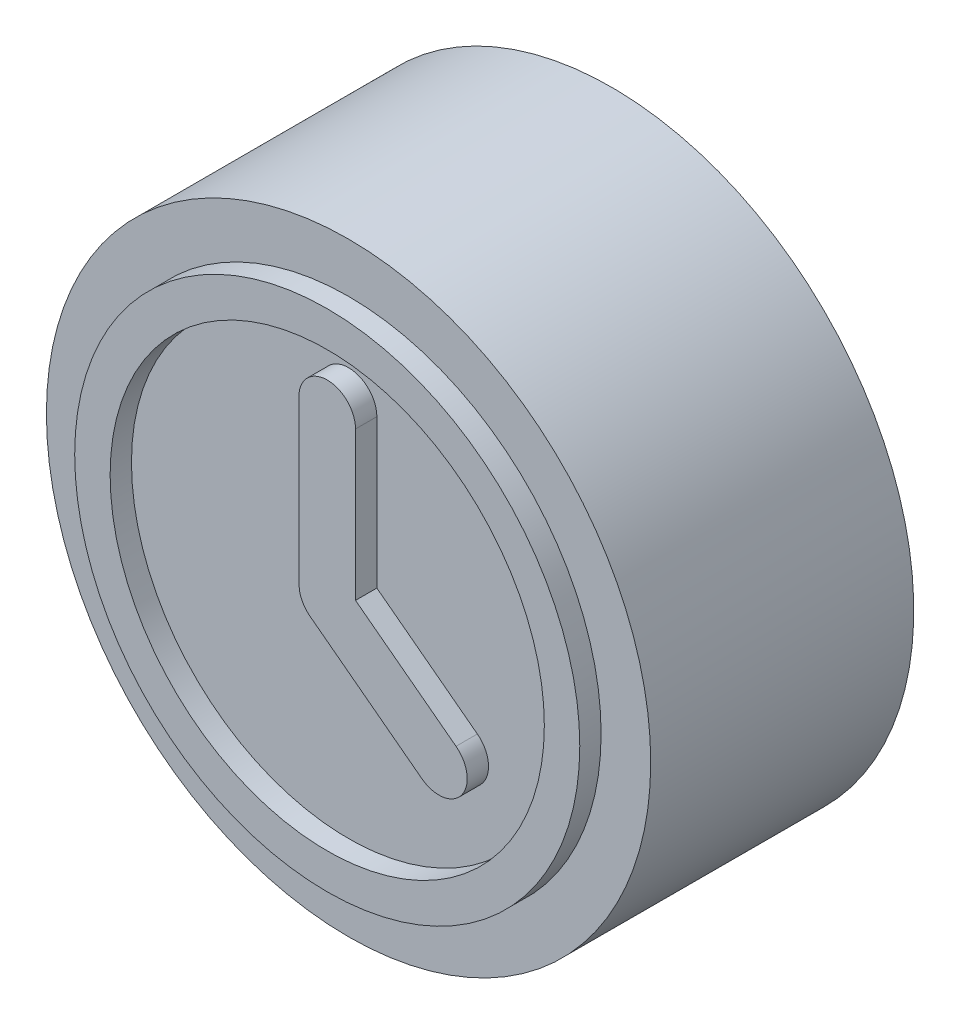
ISO-10303-21;
HEADER;
FILE_DESCRIPTION(('STEP AP214'),'2;1');
FILE_NAME('part.step','',(''),(''),'','','');
FILE_SCHEMA(('AUTOMOTIVE_DESIGN { 1 0 10303 214 1 1 1 1 }'));
ENDSEC;
DATA;
#1=APPLICATION_CONTEXT('core data for automotive mechanical design processes');
#2=APPLICATION_PROTOCOL_DEFINITION('international standard','automotive_design',2000,#1);
#3=PRODUCT_CONTEXT('',#1,'mechanical');
#4=PRODUCT('Part','Part','',(#3));
#5=PRODUCT_RELATED_PRODUCT_CATEGORY('part','',(#4));
#6=PRODUCT_DEFINITION_FORMATION('','',#4);
#7=PRODUCT_DEFINITION_CONTEXT('part definition',#1,'design');
#8=PRODUCT_DEFINITION('design','',#6,#7);
#9=PRODUCT_DEFINITION_SHAPE('','',#8);
#10=(LENGTH_UNIT() NAMED_UNIT(*) SI_UNIT(.MILLI.,.METRE.));
#11=(NAMED_UNIT(*) PLANE_ANGLE_UNIT() SI_UNIT($,.RADIAN.));
#12=(NAMED_UNIT(*) SI_UNIT($,.STERADIAN.) SOLID_ANGLE_UNIT());
#13=UNCERTAINTY_MEASURE_WITH_UNIT(LENGTH_MEASURE(1.E-05),#10,'distance_accuracy_value','');
#14=(GEOMETRIC_REPRESENTATION_CONTEXT(3) GLOBAL_UNCERTAINTY_ASSIGNED_CONTEXT((#13)) GLOBAL_UNIT_ASSIGNED_CONTEXT((#10,
#11,#12)) REPRESENTATION_CONTEXT('',''));
#15=CARTESIAN_POINT('',(0.,0.,0.));
#16=DIRECTION('',(0.,0.,1.));
#17=DIRECTION('',(1.,0.,0.));
#18=AXIS2_PLACEMENT_3D('',#15,#16,#17);
#19=CARTESIAN_POINT('',(0.,0.,4.4));
#20=DIRECTION('',(0.,0.,1.));
#21=DIRECTION('',(1.,0.,0.));
#22=AXIS2_PLACEMENT_3D('',#19,#20,#21);
#23=PLANE('',#22);
#24=CARTESIAN_POINT('',(0.,0.,4.4));
#25=DIRECTION('',(0.,0.,1.));
#26=DIRECTION('',(1.,0.,0.));
#27=AXIS2_PLACEMENT_3D('',#24,#25,#26);
#28=CIRCLE('',#27,6.10729840471998);
#29=CARTESIAN_POINT('',(6.10729840471998,0.,4.4));
#30=VERTEX_POINT('',#29);
#31=EDGE_CURVE('E12',#30,#30,#28,.F.);
#32=ORIENTED_EDGE('',*,*,#31,.F.);
#33=EDGE_LOOP('',(#32));
#34=FACE_BOUND('',#33,.T.);
#35=DIRECTION('',(0.,1.,0.));
#36=VECTOR('',#35,1.);
#37=CARTESIAN_POINT('',(-0.795758580455441,0.,4.4));
#38=LINE('',#37,#36);
#39=CARTESIAN_POINT('',(-0.795758580455441,0.,4.4));
#40=VERTEX_POINT('',#39);
#41=CARTESIAN_POINT('',(-0.795758580455441,4.57097817354679,4.4));
#42=VERTEX_POINT('',#41);
#43=EDGE_CURVE('E155',#40,#42,#38,.T.);
#44=ORIENTED_EDGE('',*,*,#43,.T.);
#45=CARTESIAN_POINT('',(0.,4.57097817354679,4.4));
#46=DIRECTION('',(0.,0.,1.));
#47=DIRECTION('',(1.,0.,0.));
#48=AXIS2_PLACEMENT_3D('',#45,#46,#47);
#49=CIRCLE('',#48,0.795758580455441);
#50=CARTESIAN_POINT('',(0.795758580455441,4.57097817354679,4.4));
#51=VERTEX_POINT('',#50);
#52=EDGE_CURVE('E174',#51,#42,#49,.T.);
#53=ORIENTED_EDGE('',*,*,#52,.F.);
#54=DIRECTION('',(0.,1.,0.));
#55=VECTOR('',#54,1.);
#56=CARTESIAN_POINT('',(0.795758580455441,0.,4.4));
#57=LINE('',#56,#55);
#58=CARTESIAN_POINT('',(0.795758580455441,0.395496115341412,4.4));
#59=VERTEX_POINT('',#58);
#60=EDGE_CURVE('E172',#59,#51,#57,.T.);
#61=ORIENTED_EDGE('',*,*,#60,.F.);
#62=DIRECTION('',(0.797112309194516,-0.603831074498974,0.));
#63=VECTOR('',#62,1.);
#64=CARTESIAN_POINT('',(0.480503758678187,0.634308959628187,4.4));
#65=LINE('',#64,#63);
#66=CARTESIAN_POINT('',(3.62263877598084,-1.74593124220229,4.4));
#67=VERTEX_POINT('',#66);
#68=EDGE_CURVE('E137',#59,#67,#65,.T.);
#69=ORIENTED_EDGE('',*,*,#68,.T.);
#70=CARTESIAN_POINT('',(3.14213501730265,-2.38024020183047,4.4));
#71=DIRECTION('',(0.,0.,1.));
#72=DIRECTION('',(1.,0.,0.));
#73=AXIS2_PLACEMENT_3D('',#70,#71,#72);
#74=CIRCLE('',#73,0.795758580455442);
#75=CARTESIAN_POINT('',(2.66163125862446,-3.01454916145866,4.4));
#76=VERTEX_POINT('',#75);
#77=EDGE_CURVE('E168',#76,#67,#74,.T.);
#78=ORIENTED_EDGE('',*,*,#77,.F.);
#79=DIRECTION('',(0.797112309194516,-0.603831074498974,0.));
#80=VECTOR('',#79,1.);
#81=CARTESIAN_POINT('',(-0.480503758678188,-0.634308959628188,4.4));
#82=LINE('',#81,#80);
#83=CARTESIAN_POINT('',(-0.480503758678188,-0.634308959628188,4.4));
#84=VERTEX_POINT('',#83);
#85=EDGE_CURVE('E163',#84,#76,#82,.T.);
#86=ORIENTED_EDGE('',*,*,#85,.F.);
#87=CARTESIAN_POINT('',(-0.795758580455441,0.,4.4));
#88=CARTESIAN_POINT('',(-0.782929945390614,-0.180408247039815,4.4));
#89=CARTESIAN_POINT('',(-0.768261528299403,-0.225601883986474,4.4));
#90=CARTESIAN_POINT('',(-0.677231986827146,-0.437603967855295,4.4));
#91=CARTESIAN_POINT('',(-0.573517685342335,-0.563848751407672,4.4));
#92=CARTESIAN_POINT('',(-0.480503758678188,-0.634308959628187,4.4));
#93=B_SPLINE_CURVE_WITH_KNOTS('',3,(#87,#88,#89,#90,#91,#92),.UNSPECIFIED.,.F.,.F.,(4,1,1,4),
(0.,0.528419671609288,0.628419671609288,1.),.UNSPECIFIED.);
#94=EDGE_CURVE('E158',#40,#84,#93,.T.);
#95=ORIENTED_EDGE('',*,*,#94,.F.);
#96=EDGE_LOOP('',(#44,#53,#61,#69,#78,#86,#95));
#97=FACE_BOUND('',#96,.T.);
#98=ADVANCED_FACE('F64',(#34,#97),#23,.T.);
#99=CARTESIAN_POINT('',(0.,0.,4.4));
#100=DIRECTION('',(0.,0.,-1.));
#101=DIRECTION('',(-1.,0.,0.));
#102=AXIS2_PLACEMENT_3D('',#99,#100,#101);
#103=CYLINDRICAL_SURFACE('',#102,8.5);
#104=CARTESIAN_POINT('',(0.,0.,4.4));
#105=DIRECTION('',(0.,0.,1.));
#106=DIRECTION('',(1.,0.,0.));
#107=AXIS2_PLACEMENT_3D('',#104,#105,#106);
#108=CIRCLE('',#107,8.5);
#109=CARTESIAN_POINT('',(8.5,0.,4.4));
#110=VERTEX_POINT('',#109);
#111=EDGE_CURVE('E72',#110,#110,#108,.T.);
#112=ORIENTED_EDGE('',*,*,#111,.F.);
#113=EDGE_LOOP('',(#112));
#114=FACE_BOUND('',#113,.T.);
#115=CARTESIAN_POINT('',(0.,0.,-3.));
#116=DIRECTION('',(0.,0.,-1.));
#117=DIRECTION('',(-1.,0.,0.));
#118=AXIS2_PLACEMENT_3D('',#115,#116,#117);
#119=CIRCLE('',#118,8.5);
#120=CARTESIAN_POINT('',(-8.5,0.,-3.));
#121=VERTEX_POINT('',#120);
#122=EDGE_CURVE('E204',#121,#121,#119,.T.);
#123=ORIENTED_EDGE('',*,*,#122,.F.);
#124=EDGE_LOOP('',(#123));
#125=FACE_BOUND('',#124,.T.);
#126=ADVANCED_FACE('F66',(#114,#125),#103,.T.);
#127=CARTESIAN_POINT('',(0.,0.,4.4));
#128=DIRECTION('',(0.,0.,1.));
#129=DIRECTION('',(1.,0.,0.));
#130=AXIS2_PLACEMENT_3D('',#127,#128,#129);
#131=CIRCLE('',#130,7.10430747905472);
#132=CARTESIAN_POINT('',(7.10430747905472,0.,4.4));
#133=VERTEX_POINT('',#132);
#134=EDGE_CURVE('E187',#133,#133,#131,.T.);
#135=ORIENTED_EDGE('',*,*,#134,.F.);
#136=EDGE_LOOP('',(#135));
#137=FACE_BOUND('',#136,.T.);
#138=ORIENTED_EDGE('',*,*,#111,.T.);
#139=EDGE_LOOP('',(#138));
#140=FACE_BOUND('',#139,.T.);
#141=ADVANCED_FACE('F198',(#137,#140),#23,.T.);
#142=CARTESIAN_POINT('',(0.,0.,5.));
#143=DIRECTION('',(0.,0.,-1.));
#144=DIRECTION('',(-1.,0.,0.));
#145=AXIS2_PLACEMENT_3D('',#142,#143,#144);
#146=CYLINDRICAL_SURFACE('',#145,6.10729840471998);
#147=CARTESIAN_POINT('',(0.,0.,5.));
#148=DIRECTION('',(0.,0.,1.));
#149=DIRECTION('',(1.,0.,0.));
#150=AXIS2_PLACEMENT_3D('',#147,#148,#149);
#151=CIRCLE('',#150,6.10729840471998);
#152=CARTESIAN_POINT('',(6.10729840471998,0.,5.));
#153=VERTEX_POINT('',#152);
#154=EDGE_CURVE('E188',#153,#153,#151,.T.);
#155=ORIENTED_EDGE('',*,*,#154,.T.);
#156=EDGE_LOOP('',(#155));
#157=FACE_BOUND('',#156,.T.);
#158=ORIENTED_EDGE('',*,*,#31,.T.);
#159=EDGE_LOOP('',(#158));
#160=FACE_BOUND('',#159,.T.);
#161=ADVANCED_FACE('F241',(#157,#160),#146,.F.);
#162=CARTESIAN_POINT('',(0.,0.,5.));
#163=DIRECTION('',(0.,0.,-1.));
#164=DIRECTION('',(-1.,0.,0.));
#165=AXIS2_PLACEMENT_3D('',#162,#163,#164);
#166=CYLINDRICAL_SURFACE('',#165,7.10430747905472);
#167=CARTESIAN_POINT('',(0.,0.,5.));
#168=DIRECTION('',(0.,0.,1.));
#169=DIRECTION('',(1.,0.,0.));
#170=AXIS2_PLACEMENT_3D('',#167,#168,#169);
#171=CIRCLE('',#170,7.10430747905472);
#172=CARTESIAN_POINT('',(7.10430747905472,0.,5.));
#173=VERTEX_POINT('',#172);
#174=EDGE_CURVE('E191',#173,#173,#171,.T.);
#175=ORIENTED_EDGE('',*,*,#174,.F.);
#176=EDGE_LOOP('',(#175));
#177=FACE_BOUND('',#176,.T.);
#178=ORIENTED_EDGE('',*,*,#134,.T.);
#179=EDGE_LOOP('',(#178));
#180=FACE_BOUND('',#179,.T.);
#181=ADVANCED_FACE('F237',(#177,#180),#166,.T.);
#182=CARTESIAN_POINT('',(0.,0.,5.));
#183=DIRECTION('',(0.,0.,1.));
#184=DIRECTION('',(1.,0.,0.));
#185=AXIS2_PLACEMENT_3D('',#182,#183,#184);
#186=PLANE('',#185);
#187=ORIENTED_EDGE('',*,*,#154,.F.);
#188=EDGE_LOOP('',(#187));
#189=FACE_BOUND('',#188,.T.);
#190=ORIENTED_EDGE('',*,*,#174,.T.);
#191=EDGE_LOOP('',(#190));
#192=FACE_BOUND('',#191,.T.);
#193=ADVANCED_FACE('F234',(#189,#192),#186,.T.);
#194=CARTESIAN_POINT('',(-0.795758580455441,0.,5.));
#195=DIRECTION('',(-1.,0.,0.));
#196=DIRECTION('',(0.,0.,1.));
#197=AXIS2_PLACEMENT_3D('',#194,#195,#196);
#198=PLANE('',#197);
#199=ORIENTED_EDGE('',*,*,#43,.F.);
#200=DIRECTION('',(0.,0.,-1.));
#201=VECTOR('',#200,1.);
#202=CARTESIAN_POINT('',(-0.795758580455441,0.,5.));
#203=LINE('',#202,#201);
#204=CARTESIAN_POINT('',(-0.795758580455441,0.,5.));
#205=VERTEX_POINT('',#204);
#206=EDGE_CURVE('E117',#205,#40,#203,.T.);
#207=ORIENTED_EDGE('',*,*,#206,.F.);
#208=DIRECTION('',(0.,1.,0.));
#209=VECTOR('',#208,1.);
#210=CARTESIAN_POINT('',(-0.795758580455441,0.,5.));
#211=LINE('',#210,#209);
#212=CARTESIAN_POINT('',(-0.795758580455441,4.57097817354679,5.));
#213=VERTEX_POINT('',#212);
#214=EDGE_CURVE('E176',#205,#213,#211,.T.);
#215=ORIENTED_EDGE('',*,*,#214,.T.);
#216=DIRECTION('',(0.,0.,-1.));
#217=VECTOR('',#216,1.);
#218=CARTESIAN_POINT('',(-0.795758580455441,4.57097817354679,5.));
#219=LINE('',#218,#217);
#220=EDGE_CURVE('E113',#213,#42,#219,.T.);
#221=ORIENTED_EDGE('',*,*,#220,.T.);
#222=EDGE_LOOP('',(#199,#207,#215,#221));
#223=FACE_BOUND('',#222,.T.);
#224=ADVANCED_FACE('F229',(#223),#198,.T.);
#225=CARTESIAN_POINT('',(-0.795758580455441,0.,5.));
#226=CARTESIAN_POINT('',(-0.782929945390614,-0.180408247039815,5.));
#227=CARTESIAN_POINT('',(-0.768261528299403,-0.225601883986474,5.));
#228=CARTESIAN_POINT('',(-0.677231986827146,-0.437603967855295,5.));
#229=CARTESIAN_POINT('',(-0.573517685342335,-0.563848751407672,5.));
#230=CARTESIAN_POINT('',(-0.480503758678188,-0.634308959628187,5.));
#231=B_SPLINE_CURVE_WITH_KNOTS('',3,(#225,#226,#227,#228,#229,#230),.UNSPECIFIED.,.F.,.F.,(4,1,
1,4),(0.,0.528419671609288,0.628419671609288,1.),.UNSPECIFIED.);
#232=DIRECTION('',(0.,0.,-1.));
#233=VECTOR('',#232,1.);
#234=SURFACE_OF_LINEAR_EXTRUSION('',#231,#233);
#235=ORIENTED_EDGE('',*,*,#94,.T.);
#236=DIRECTION('',(0.,0.,-1.));
#237=VECTOR('',#236,1.);
#238=CARTESIAN_POINT('',(-0.480503758678188,-0.634308959628188,5.));
#239=LINE('',#238,#237);
#240=CARTESIAN_POINT('',(-0.480503758678188,-0.634308959628188,5.));
#241=VERTEX_POINT('',#240);
#242=EDGE_CURVE('E183',#241,#84,#239,.T.);
#243=ORIENTED_EDGE('',*,*,#242,.F.);
#244=EDGE_CURVE('E216',#205,#241,#231,.T.);
#245=ORIENTED_EDGE('',*,*,#244,.F.);
#246=ORIENTED_EDGE('',*,*,#206,.T.);
#247=EDGE_LOOP('',(#235,#243,#245,#246));
#248=FACE_BOUND('',#247,.T.);
#249=ADVANCED_FACE('F224',(#248),#234,.F.);
#250=CARTESIAN_POINT('',(-0.480503758678188,-0.634308959628188,5.));
#251=DIRECTION('',(0.603831074498974,0.797112309194516,0.));
#252=DIRECTION('',(-0.797112309194516,0.603831074498974,0.));
#253=AXIS2_PLACEMENT_3D('',#250,#251,#252);
#254=PLANE('',#253);
#255=ORIENTED_EDGE('',*,*,#85,.T.);
#256=DIRECTION('',(0.,0.,-1.));
#257=VECTOR('',#256,1.);
#258=CARTESIAN_POINT('',(2.66163125862446,-3.01454916145866,5.));
#259=LINE('',#258,#257);
#260=CARTESIAN_POINT('',(2.66163125862446,-3.01454916145866,5.));
#261=VERTEX_POINT('',#260);
#262=EDGE_CURVE('E180',#261,#76,#259,.T.);
#263=ORIENTED_EDGE('',*,*,#262,.F.);
#264=DIRECTION('',(0.797112309194516,-0.603831074498974,0.));
#265=VECTOR('',#264,1.);
#266=CARTESIAN_POINT('',(-0.480503758678188,-0.634308959628188,5.));
#267=LINE('',#266,#265);
#268=EDGE_CURVE('E150',#241,#261,#267,.T.);
#269=ORIENTED_EDGE('',*,*,#268,.F.);
#270=ORIENTED_EDGE('',*,*,#242,.T.);
#271=EDGE_LOOP('',(#255,#263,#269,#270));
#272=FACE_BOUND('',#271,.T.);
#273=ADVANCED_FACE('F228',(#272),#254,.F.);
#274=CARTESIAN_POINT('',(3.14213501730265,-2.38024020183047,5.));
#275=DIRECTION('',(0.,0.,-1.));
#276=DIRECTION('',(-1.,0.,0.));
#277=AXIS2_PLACEMENT_3D('',#274,#275,#276);
#278=CYLINDRICAL_SURFACE('',#277,0.795758580455442);
#279=ORIENTED_EDGE('',*,*,#77,.T.);
#280=DIRECTION('',(0.,0.,-1.));
#281=VECTOR('',#280,1.);
#282=CARTESIAN_POINT('',(3.62263877598084,-1.74593124220229,5.));
#283=LINE('',#282,#281);
#284=CARTESIAN_POINT('',(3.62263877598084,-1.74593124220229,5.));
#285=VERTEX_POINT('',#284);
#286=EDGE_CURVE('E140',#285,#67,#283,.T.);
#287=ORIENTED_EDGE('',*,*,#286,.F.);
#288=CARTESIAN_POINT('',(3.14213501730265,-2.38024020183047,5.));
#289=DIRECTION('',(0.,0.,1.));
#290=DIRECTION('',(1.,0.,0.));
#291=AXIS2_PLACEMENT_3D('',#288,#289,#290);
#292=CIRCLE('',#291,0.795758580455442);
#293=EDGE_CURVE('E147',#261,#285,#292,.T.);
#294=ORIENTED_EDGE('',*,*,#293,.F.);
#295=ORIENTED_EDGE('',*,*,#262,.T.);
#296=EDGE_LOOP('',(#279,#287,#294,#295));
#297=FACE_BOUND('',#296,.T.);
#298=ADVANCED_FACE('F265',(#297),#278,.T.);
#299=CARTESIAN_POINT('',(0.480503758678187,0.634308959628187,5.));
#300=DIRECTION('',(0.603831074498974,0.797112309194516,0.));
#301=DIRECTION('',(-0.797112309194516,0.603831074498974,0.));
#302=AXIS2_PLACEMENT_3D('',#299,#300,#301);
#303=PLANE('',#302);
#304=ORIENTED_EDGE('',*,*,#68,.F.);
#305=DIRECTION('',(0.,0.,-1.));
#306=VECTOR('',#305,1.);
#307=CARTESIAN_POINT('',(0.795758580455441,0.395496115341412,5.));
#308=LINE('',#307,#306);
#309=CARTESIAN_POINT('',(0.795758580455441,0.395496115341412,5.));
#310=VERTEX_POINT('',#309);
#311=EDGE_CURVE('E131',#310,#59,#308,.T.);
#312=ORIENTED_EDGE('',*,*,#311,.F.);
#313=DIRECTION('',(0.797112309194516,-0.603831074498974,0.));
#314=VECTOR('',#313,1.);
#315=CARTESIAN_POINT('',(0.480503758678187,0.634308959628187,5.));
#316=LINE('',#315,#314);
#317=EDGE_CURVE('E135',#310,#285,#316,.T.);
#318=ORIENTED_EDGE('',*,*,#317,.T.);
#319=ORIENTED_EDGE('',*,*,#286,.T.);
#320=EDGE_LOOP('',(#304,#312,#318,#319));
#321=FACE_BOUND('',#320,.T.);
#322=ADVANCED_FACE('F133',(#321),#303,.T.);
#323=CARTESIAN_POINT('',(0.795758580455441,0.,5.));
#324=DIRECTION('',(-1.,0.,0.));
#325=DIRECTION('',(0.,-1.,0.));
#326=AXIS2_PLACEMENT_3D('',#323,#324,#325);
#327=PLANE('',#326);
#328=ORIENTED_EDGE('',*,*,#60,.T.);
#329=DIRECTION('',(0.,0.,-1.));
#330=VECTOR('',#329,1.);
#331=CARTESIAN_POINT('',(0.795758580455441,4.57097817354679,5.));
#332=LINE('',#331,#330);
#333=CARTESIAN_POINT('',(0.795758580455441,4.57097817354679,5.));
#334=VERTEX_POINT('',#333);
#335=EDGE_CURVE('E79',#334,#51,#332,.T.);
#336=ORIENTED_EDGE('',*,*,#335,.F.);
#337=DIRECTION('',(0.,1.,0.));
#338=VECTOR('',#337,1.);
#339=CARTESIAN_POINT('',(0.795758580455441,0.,5.));
#340=LINE('',#339,#338);
#341=EDGE_CURVE('E142',#310,#334,#340,.T.);
#342=ORIENTED_EDGE('',*,*,#341,.F.);
#343=ORIENTED_EDGE('',*,*,#311,.T.);
#344=EDGE_LOOP('',(#328,#336,#342,#343));
#345=FACE_BOUND('',#344,.T.);
#346=ADVANCED_FACE('F143',(#345),#327,.F.);
#347=CARTESIAN_POINT('',(0.,4.57097817354679,5.));
#348=DIRECTION('',(0.,0.,-1.));
#349=DIRECTION('',(-1.,0.,0.));
#350=AXIS2_PLACEMENT_3D('',#347,#348,#349);
#351=CYLINDRICAL_SURFACE('',#350,0.795758580455441);
#352=ORIENTED_EDGE('',*,*,#52,.T.);
#353=ORIENTED_EDGE('',*,*,#220,.F.);
#354=CARTESIAN_POINT('',(0.,4.57097817354679,5.));
#355=DIRECTION('',(0.,0.,1.));
#356=DIRECTION('',(1.,0.,0.));
#357=AXIS2_PLACEMENT_3D('',#354,#355,#356);
#358=CIRCLE('',#357,0.795758580455441);
#359=EDGE_CURVE('E87',#334,#213,#358,.T.);
#360=ORIENTED_EDGE('',*,*,#359,.F.);
#361=ORIENTED_EDGE('',*,*,#335,.T.);
#362=EDGE_LOOP('',(#352,#353,#360,#361));
#363=FACE_BOUND('',#362,.T.);
#364=ADVANCED_FACE('F275',(#363),#351,.T.);
#365=CARTESIAN_POINT('',(0.,0.,5.));
#366=DIRECTION('',(0.,0.,1.));
#367=DIRECTION('',(1.,0.,0.));
#368=AXIS2_PLACEMENT_3D('',#365,#366,#367);
#369=PLANE('',#368);
#370=ORIENTED_EDGE('',*,*,#214,.F.);
#371=ORIENTED_EDGE('',*,*,#244,.T.);
#372=ORIENTED_EDGE('',*,*,#268,.T.);
#373=ORIENTED_EDGE('',*,*,#293,.T.);
#374=ORIENTED_EDGE('',*,*,#317,.F.);
#375=ORIENTED_EDGE('',*,*,#341,.T.);
#376=ORIENTED_EDGE('',*,*,#359,.T.);
#377=EDGE_LOOP('',(#370,#371,#372,#373,#374,#375,#376));
#378=FACE_BOUND('',#377,.T.);
#379=ADVANCED_FACE('F145',(#378),#369,.T.);
#380=CARTESIAN_POINT('',(0.,0.,-3.));
#381=DIRECTION('',(0.,0.,-1.));
#382=DIRECTION('',(-1.,0.,0.));
#383=AXIS2_PLACEMENT_3D('',#380,#381,#382);
#384=PLANE('',#383);
#385=ORIENTED_EDGE('',*,*,#122,.T.);
#386=EDGE_LOOP('',(#385));
#387=FACE_BOUND('',#386,.T.);
#388=CARTESIAN_POINT('',(0.,0.,-3.));
#389=DIRECTION('',(0.,0.,-1.));
#390=DIRECTION('',(-1.,0.,0.));
#391=AXIS2_PLACEMENT_3D('',#388,#389,#390);
#392=CIRCLE('',#391,7.5);
#393=CARTESIAN_POINT('',(-7.5,0.,-3.));
#394=VERTEX_POINT('',#393);
#395=EDGE_CURVE('E206',#394,#394,#392,.T.);
#396=ORIENTED_EDGE('',*,*,#395,.F.);
#397=EDGE_LOOP('',(#396));
#398=FACE_BOUND('',#397,.T.);
#399=ADVANCED_FACE('F280',(#387,#398),#384,.T.);
#400=CARTESIAN_POINT('',(0.,0.,-3.));
#401=DIRECTION('',(0.,0.,1.));
#402=DIRECTION('',(1.,0.,0.));
#403=AXIS2_PLACEMENT_3D('',#400,#401,#402);
#404=CYLINDRICAL_SURFACE('',#403,7.5);
#405=ORIENTED_EDGE('',*,*,#395,.T.);
#406=EDGE_LOOP('',(#405));
#407=FACE_BOUND('',#406,.T.);
#408=CARTESIAN_POINT('',(0.,0.,0.));
#409=DIRECTION('',(0.,0.,-1.));
#410=DIRECTION('',(-1.,0.,0.));
#411=AXIS2_PLACEMENT_3D('',#408,#409,#410);
#412=CIRCLE('',#411,7.5);
#413=CARTESIAN_POINT('',(-7.5,0.,0.));
#414=VERTEX_POINT('',#413);
#415=EDGE_CURVE('E303',#414,#414,#412,.T.);
#416=ORIENTED_EDGE('',*,*,#415,.F.);
#417=EDGE_LOOP('',(#416));
#418=FACE_BOUND('',#417,.T.);
#419=ADVANCED_FACE('F292',(#407,#418),#404,.F.);
#420=CARTESIAN_POINT('',(0.,0.,1.69999999999998));
#421=DIRECTION('',(0.,0.,-1.));
#422=DIRECTION('',(-1.,0.,0.));
#423=AXIS2_PLACEMENT_3D('',#420,#421,#422);
#424=CONICAL_SURFACE('',#423,5.8,0.785398163397454);
#425=ORIENTED_EDGE('',*,*,#415,.T.);
#426=EDGE_LOOP('',(#425));
#427=FACE_BOUND('',#426,.T.);
#428=CARTESIAN_POINT('',(0.,0.,1.69999999999998));
#429=DIRECTION('',(0.,0.,-1.));
#430=DIRECTION('',(-1.,0.,0.));
#431=AXIS2_PLACEMENT_3D('',#428,#429,#430);
#432=CIRCLE('',#431,5.8);
#433=CARTESIAN_POINT('',(-5.8,0.,1.69999999999998));
#434=VERTEX_POINT('',#433);
#435=EDGE_CURVE('E211',#434,#434,#432,.T.);
#436=ORIENTED_EDGE('',*,*,#435,.F.);
#437=EDGE_LOOP('',(#436));
#438=FACE_BOUND('',#437,.T.);
#439=ADVANCED_FACE('F288',(#427,#438),#424,.F.);
#440=CARTESIAN_POINT('',(0.,0.,4.));
#441=DIRECTION('',(0.,0.,-1.));
#442=DIRECTION('',(-1.,0.,0.));
#443=AXIS2_PLACEMENT_3D('',#440,#441,#442);
#444=PLANE('',#443);
#445=CARTESIAN_POINT('',(0.,0.,4.));
#446=DIRECTION('',(0.,0.,-1.));
#447=DIRECTION('',(-1.,0.,0.));
#448=AXIS2_PLACEMENT_3D('',#445,#446,#447);
#449=CIRCLE('',#448,5.8);
#450=CARTESIAN_POINT('',(-5.8,0.,4.));
#451=VERTEX_POINT('',#450);
#452=EDGE_CURVE('E159',#451,#451,#449,.T.);
#453=ORIENTED_EDGE('',*,*,#452,.T.);
#454=EDGE_LOOP('',(#453));
#455=FACE_BOUND('',#454,.T.);
#456=ADVANCED_FACE('F284',(#455),#444,.T.);
#457=CARTESIAN_POINT('',(0.,0.,4.));
#458=DIRECTION('',(0.,0.,-1.));
#459=DIRECTION('',(-1.,0.,0.));
#460=AXIS2_PLACEMENT_3D('',#457,#458,#459);
#461=CYLINDRICAL_SURFACE('',#460,5.8);
#462=ORIENTED_EDGE('',*,*,#452,.F.);
#463=EDGE_LOOP('',(#462));
#464=FACE_BOUND('',#463,.T.);
#465=ORIENTED_EDGE('',*,*,#435,.T.);
#466=EDGE_LOOP('',(#465));
#467=FACE_BOUND('',#466,.T.);
#468=ADVANCED_FACE('F281',(#464,#467),#461,.F.);
#469=CLOSED_SHELL('',(#98,#126,#141,#161,#181,#193,#224,#249,#273,#298,#322,#346,#364,#379,#399,
#419,#439,#456,#468));
#470=MANIFOLD_SOLID_BREP('B2',#469);
#471=ADVANCED_BREP_SHAPE_REPRESENTATION('',(#18,#470),#14);
#472=SHAPE_DEFINITION_REPRESENTATION(#9,#471);
ENDSEC;
END-ISO-10303-21;
